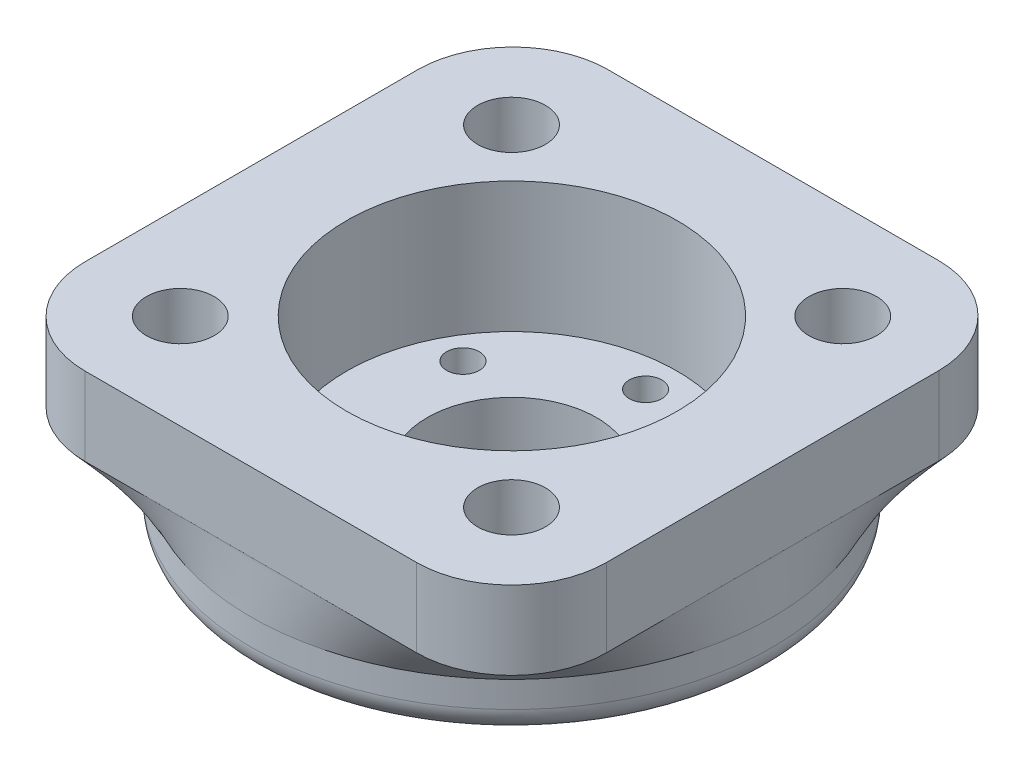
ISO-10303-21;
HEADER;
FILE_DESCRIPTION(('STEP AP214'),'2;1');
FILE_NAME('part.step','',(''),(''),'','','');
FILE_SCHEMA(('AUTOMOTIVE_DESIGN { 1 0 10303 214 1 1 1 1 }'));
ENDSEC;
DATA;
#1=APPLICATION_CONTEXT('core data for automotive mechanical design processes');
#2=APPLICATION_PROTOCOL_DEFINITION('international standard','automotive_design',2000,#1);
#3=PRODUCT_CONTEXT('',#1,'mechanical');
#4=PRODUCT('Part','Part','',(#3));
#5=PRODUCT_RELATED_PRODUCT_CATEGORY('part','',(#4));
#6=PRODUCT_DEFINITION_FORMATION('','',#4);
#7=PRODUCT_DEFINITION_CONTEXT('part definition',#1,'design');
#8=PRODUCT_DEFINITION('design','',#6,#7);
#9=PRODUCT_DEFINITION_SHAPE('','',#8);
#10=(LENGTH_UNIT() NAMED_UNIT(*) SI_UNIT(.MILLI.,.METRE.));
#11=(NAMED_UNIT(*) PLANE_ANGLE_UNIT() SI_UNIT($,.RADIAN.));
#12=(NAMED_UNIT(*) SI_UNIT($,.STERADIAN.) SOLID_ANGLE_UNIT());
#13=UNCERTAINTY_MEASURE_WITH_UNIT(LENGTH_MEASURE(1.E-05),#10,'distance_accuracy_value','');
#14=(GEOMETRIC_REPRESENTATION_CONTEXT(3) GLOBAL_UNCERTAINTY_ASSIGNED_CONTEXT((#13)) GLOBAL_UNIT_ASSIGNED_CONTEXT((#10,
#11,#12)) REPRESENTATION_CONTEXT('',''));
#15=CARTESIAN_POINT('',(0.,0.,0.));
#16=DIRECTION('',(0.,0.,1.));
#17=DIRECTION('',(1.,0.,0.));
#18=AXIS2_PLACEMENT_3D('',#15,#16,#17);
#19=CARTESIAN_POINT('',(0.394837528344683,4.,-0.526450037792892));
#20=DIRECTION('',(0.,-1.,0.));
#21=DIRECTION('',(0.,0.,-1.));
#22=AXIS2_PLACEMENT_3D('',#19,#20,#21);
#23=CYLINDRICAL_SURFACE('',#22,6.50000000000031);
#24=CARTESIAN_POINT('',(0.394837528344683,4.,-0.526450037792892));
#25=DIRECTION('',(0.,1.,0.));
#26=DIRECTION('',(0.,0.,1.));
#27=AXIS2_PLACEMENT_3D('',#24,#25,#26);
#28=CIRCLE('',#27,6.50000000000031);
#29=CARTESIAN_POINT('',(0.394837528344683,4.,5.97354996220742));
#30=VERTEX_POINT('',#29);
#31=EDGE_CURVE('E605',#30,#30,#28,.T.);
#32=ORIENTED_EDGE('',*,*,#31,.T.);
#33=EDGE_LOOP('',(#32));
#34=FACE_BOUND('',#33,.T.);
#35=CARTESIAN_POINT('',(0.394837528344683,0.,-0.526450037792892));
#36=DIRECTION('',(0.,1.,0.));
#37=DIRECTION('',(0.,0.,1.));
#38=AXIS2_PLACEMENT_3D('',#35,#36,#37);
#39=CIRCLE('',#38,6.50000000000031);
#40=CARTESIAN_POINT('',(0.394837528344683,0.,5.97354996220742));
#41=VERTEX_POINT('',#40);
#42=EDGE_CURVE('E633',#41,#41,#39,.T.);
#43=ORIENTED_EDGE('',*,*,#42,.F.);
#44=EDGE_LOOP('',(#43));
#45=FACE_BOUND('',#44,.T.);
#46=ADVANCED_FACE('F193',(#34,#45),#23,.F.);
#47=CARTESIAN_POINT('',(0.394837528344611,4.,9.72354996220711));
#48=DIRECTION('',(0.,-1.,0.));
#49=DIRECTION('',(0.,0.,-1.));
#50=AXIS2_PLACEMENT_3D('',#47,#48,#49);
#51=CYLINDRICAL_SURFACE('',#50,1.25);
#52=CARTESIAN_POINT('',(0.394837528344611,4.,9.72354996220711));
#53=DIRECTION('',(0.,1.,0.));
#54=DIRECTION('',(0.,0.,1.));
#55=AXIS2_PLACEMENT_3D('',#52,#53,#54);
#56=CIRCLE('',#55,1.25);
#57=CARTESIAN_POINT('',(0.394837528344611,4.,10.9735499622071));
#58=VERTEX_POINT('',#57);
#59=EDGE_CURVE('E601',#58,#58,#56,.T.);
#60=ORIENTED_EDGE('',*,*,#59,.T.);
#61=EDGE_LOOP('',(#60));
#62=FACE_BOUND('',#61,.T.);
#63=CARTESIAN_POINT('',(0.394837528344611,0.,9.72354996220711));
#64=DIRECTION('',(0.,1.,0.));
#65=DIRECTION('',(0.,0.,1.));
#66=AXIS2_PLACEMENT_3D('',#63,#64,#65);
#67=CIRCLE('',#66,1.25);
#68=CARTESIAN_POINT('',(0.394837528344611,0.,10.9735499622071));
#69=VERTEX_POINT('',#68);
#70=EDGE_CURVE('E629',#69,#69,#67,.T.);
#71=ORIENTED_EDGE('',*,*,#70,.F.);
#72=EDGE_LOOP('',(#71));
#73=FACE_BOUND('',#72,.T.);
#74=ADVANCED_FACE('F654',(#62,#73),#51,.F.);
#75=CARTESIAN_POINT('',(-8.48192286044587,4.,4.59854996220703));
#76=DIRECTION('',(0.,-1.,0.));
#77=DIRECTION('',(0.,0.,-1.));
#78=AXIS2_PLACEMENT_3D('',#75,#76,#77);
#79=CYLINDRICAL_SURFACE('',#78,1.24999999999999);
#80=CARTESIAN_POINT('',(-8.48192286044587,4.,4.59854996220703));
#81=DIRECTION('',(0.,1.,0.));
#82=DIRECTION('',(0.,0.,1.));
#83=AXIS2_PLACEMENT_3D('',#80,#81,#82);
#84=CIRCLE('',#83,1.24999999999999);
#85=CARTESIAN_POINT('',(-8.48192286044587,4.,5.84854996220702));
#86=VERTEX_POINT('',#85);
#87=EDGE_CURVE('E597',#86,#86,#84,.T.);
#88=ORIENTED_EDGE('',*,*,#87,.T.);
#89=EDGE_LOOP('',(#88));
#90=FACE_BOUND('',#89,.T.);
#91=CARTESIAN_POINT('',(-8.48192286044587,0.,4.59854996220703));
#92=DIRECTION('',(0.,1.,0.));
#93=DIRECTION('',(0.,0.,1.));
#94=AXIS2_PLACEMENT_3D('',#91,#92,#93);
#95=CIRCLE('',#94,1.24999999999999);
#96=CARTESIAN_POINT('',(-8.48192286044587,0.,5.84854996220702));
#97=VERTEX_POINT('',#96);
#98=EDGE_CURVE('E625',#97,#97,#95,.T.);
#99=ORIENTED_EDGE('',*,*,#98,.F.);
#100=EDGE_LOOP('',(#99));
#101=FACE_BOUND('',#100,.T.);
#102=ADVANCED_FACE('F658',(#90,#101),#79,.F.);
#103=CARTESIAN_POINT('',(-8.48192286044576,4.,-5.65145003779299));
#104=DIRECTION('',(0.,-1.,0.));
#105=DIRECTION('',(0.,0.,-1.));
#106=AXIS2_PLACEMENT_3D('',#103,#104,#105);
#107=CYLINDRICAL_SURFACE('',#106,1.25);
#108=CARTESIAN_POINT('',(-8.48192286044576,4.,-5.65145003779299));
#109=DIRECTION('',(0.,1.,0.));
#110=DIRECTION('',(0.,0.,1.));
#111=AXIS2_PLACEMENT_3D('',#108,#109,#110);
#112=CIRCLE('',#111,1.25);
#113=CARTESIAN_POINT('',(-8.48192286044576,4.,-4.40145003779299));
#114=VERTEX_POINT('',#113);
#115=EDGE_CURVE('E593',#114,#114,#112,.T.);
#116=ORIENTED_EDGE('',*,*,#115,.T.);
#117=EDGE_LOOP('',(#116));
#118=FACE_BOUND('',#117,.T.);
#119=CARTESIAN_POINT('',(-8.48192286044576,0.,-5.65145003779299));
#120=DIRECTION('',(0.,1.,0.));
#121=DIRECTION('',(0.,0.,1.));
#122=AXIS2_PLACEMENT_3D('',#119,#120,#121);
#123=CIRCLE('',#122,1.25);
#124=CARTESIAN_POINT('',(-8.48192286044576,0.,-4.40145003779299));
#125=VERTEX_POINT('',#124);
#126=EDGE_CURVE('E621',#125,#125,#123,.T.);
#127=ORIENTED_EDGE('',*,*,#126,.F.);
#128=EDGE_LOOP('',(#127));
#129=FACE_BOUND('',#128,.T.);
#130=ADVANCED_FACE('F662',(#118,#129),#107,.F.);
#131=CARTESIAN_POINT('',(0.394837528344683,4.,-10.7764500377929));
#132=DIRECTION('',(0.,-1.,0.));
#133=DIRECTION('',(0.,0.,-1.));
#134=AXIS2_PLACEMENT_3D('',#131,#132,#133);
#135=CYLINDRICAL_SURFACE('',#134,1.25);
#136=CARTESIAN_POINT('',(0.394837528344683,4.,-10.7764500377929));
#137=DIRECTION('',(0.,1.,0.));
#138=DIRECTION('',(0.,0.,1.));
#139=AXIS2_PLACEMENT_3D('',#136,#137,#138);
#140=CIRCLE('',#139,1.25);
#141=CARTESIAN_POINT('',(0.394837528344683,4.,-9.52645003779289));
#142=VERTEX_POINT('',#141);
#143=EDGE_CURVE('E589',#142,#142,#140,.T.);
#144=ORIENTED_EDGE('',*,*,#143,.T.);
#145=EDGE_LOOP('',(#144));
#146=FACE_BOUND('',#145,.T.);
#147=CARTESIAN_POINT('',(0.394837528344683,0.,-10.7764500377929));
#148=DIRECTION('',(0.,1.,0.));
#149=DIRECTION('',(0.,0.,1.));
#150=AXIS2_PLACEMENT_3D('',#147,#148,#149);
#151=CIRCLE('',#150,1.25);
#152=CARTESIAN_POINT('',(0.394837528344683,0.,-9.52645003779289));
#153=VERTEX_POINT('',#152);
#154=EDGE_CURVE('E617',#153,#153,#151,.T.);
#155=ORIENTED_EDGE('',*,*,#154,.F.);
#156=EDGE_LOOP('',(#155));
#157=FACE_BOUND('',#156,.T.);
#158=ADVANCED_FACE('F666',(#146,#157),#135,.F.);
#159=CARTESIAN_POINT('',(9.27159791713519,4.,-5.65145003779289));
#160=DIRECTION('',(0.,-1.,0.));
#161=DIRECTION('',(0.,0.,-1.));
#162=AXIS2_PLACEMENT_3D('',#159,#160,#161);
#163=CYLINDRICAL_SURFACE('',#162,1.24999999999999);
#164=CARTESIAN_POINT('',(9.27159791713519,4.,-5.65145003779289));
#165=DIRECTION('',(0.,1.,0.));
#166=DIRECTION('',(0.,0.,1.));
#167=AXIS2_PLACEMENT_3D('',#164,#165,#166);
#168=CIRCLE('',#167,1.24999999999999);
#169=CARTESIAN_POINT('',(9.27159791713519,4.,-4.4014500377929));
#170=VERTEX_POINT('',#169);
#171=EDGE_CURVE('E584',#170,#170,#168,.T.);
#172=ORIENTED_EDGE('',*,*,#171,.T.);
#173=EDGE_LOOP('',(#172));
#174=FACE_BOUND('',#173,.T.);
#175=CARTESIAN_POINT('',(9.27159791713519,0.,-5.65145003779289));
#176=DIRECTION('',(0.,1.,0.));
#177=DIRECTION('',(0.,0.,1.));
#178=AXIS2_PLACEMENT_3D('',#175,#176,#177);
#179=CIRCLE('',#178,1.24999999999999);
#180=CARTESIAN_POINT('',(9.27159791713519,0.,-4.4014500377929));
#181=VERTEX_POINT('',#180);
#182=EDGE_CURVE('E613',#181,#181,#179,.T.);
#183=ORIENTED_EDGE('',*,*,#182,.F.);
#184=EDGE_LOOP('',(#183));
#185=FACE_BOUND('',#184,.T.);
#186=ADVANCED_FACE('F670',(#174,#185),#163,.F.);
#187=CARTESIAN_POINT('',(9.27159791713516,4.,4.59854996220711));
#188=DIRECTION('',(0.,-1.,0.));
#189=DIRECTION('',(0.,0.,-1.));
#190=AXIS2_PLACEMENT_3D('',#187,#188,#189);
#191=CYLINDRICAL_SURFACE('',#190,1.26386065401982);
#192=CARTESIAN_POINT('',(9.27159791713516,4.,4.59854996220711));
#193=DIRECTION('',(0.,1.,0.));
#194=DIRECTION('',(0.,0.,1.));
#195=AXIS2_PLACEMENT_3D('',#192,#193,#194);
#196=CIRCLE('',#195,1.26386065401982);
#197=CARTESIAN_POINT('',(9.27159791713516,4.,5.86241061622693));
#198=VERTEX_POINT('',#197);
#199=EDGE_CURVE('E580',#198,#198,#196,.T.);
#200=ORIENTED_EDGE('',*,*,#199,.T.);
#201=EDGE_LOOP('',(#200));
#202=FACE_BOUND('',#201,.T.);
#203=CARTESIAN_POINT('',(9.27159791713516,0.,4.59854996220711));
#204=DIRECTION('',(0.,1.,0.));
#205=DIRECTION('',(0.,0.,1.));
#206=AXIS2_PLACEMENT_3D('',#203,#204,#205);
#207=CIRCLE('',#206,1.26386065401982);
#208=CARTESIAN_POINT('',(9.27159791713516,0.,5.86241061622693));
#209=VERTEX_POINT('',#208);
#210=EDGE_CURVE('E385',#209,#209,#207,.T.);
#211=ORIENTED_EDGE('',*,*,#210,.F.);
#212=EDGE_LOOP('',(#211));
#213=FACE_BOUND('',#212,.T.);
#214=ADVANCED_FACE('F650',(#202,#213),#191,.F.);
#215=CARTESIAN_POINT('',(0.394837528344683,4.,-0.526450037792892));
#216=DIRECTION('',(0.,-1.,0.));
#217=DIRECTION('',(0.,0.,-1.));
#218=AXIS2_PLACEMENT_3D('',#215,#216,#217);
#219=CYLINDRICAL_SURFACE('',#218,20.);
#220=CARTESIAN_POINT('',(0.394837528344683,2.,-0.526450037792892));
#221=DIRECTION('',(0.,1.,0.));
#222=DIRECTION('',(0.,0.,1.));
#223=AXIS2_PLACEMENT_3D('',#220,#221,#222);
#224=CIRCLE('',#223,20.);
#225=CARTESIAN_POINT('',(0.394837528344683,2.,19.4735499622071));
#226=VERTEX_POINT('',#225);
#227=EDGE_CURVE('E202',#226,#226,#224,.T.);
#228=ORIENTED_EDGE('',*,*,#227,.T.);
#229=EDGE_LOOP('',(#228));
#230=FACE_BOUND('',#229,.T.);
#231=CARTESIAN_POINT('',(17.2623550113204,4.,-11.2729310414288));
#232=CARTESIAN_POINT('',(16.8472630465657,4.,-11.9244532439222));
#233=CARTESIAN_POINT('',(15.9784248748347,3.99999999999999,-13.1242882814573));
#234=CARTESIAN_POINT('',(14.5442368778005,4.00000000000001,-14.7147888358139));
#235=CARTESIAN_POINT('',(12.9499665411757,4.,-16.1444470503483));
#236=CARTESIAN_POINT('',(11.7481686373102,4.,-17.0097155118139));
#237=CARTESIAN_POINT('',(9.53911566240006,4.,-18.4087802388518));
#238=CARTESIAN_POINT('',(6.09924045383232,4.,-19.9782041450023));
#239=CARTESIAN_POINT('',(0.387221258468894,4.,-20.8022193623676));
#240=CARTESIAN_POINT('',(-5.32437062189815,3.99999999999999,-19.9738937771033));
#241=CARTESIAN_POINT('',(-8.76336978348836,4.,-18.4016733878634));
#242=CARTESIAN_POINT('',(-10.9678231444701,4.,-17.0030818995773));
#243=CARTESIAN_POINT('',(-12.1623958960564,4.,-16.1421902956546));
#244=CARTESIAN_POINT('',(-13.7478057921111,4.,-14.7209184903639));
#245=CARTESIAN_POINT('',(-15.1750364842467,4.,-13.140536028565));
#246=CARTESIAN_POINT('',(-16.0405899202001,4.,-11.9486587772768));
#247=CARTESIAN_POINT('',(-17.4541821027537,4.,-9.73817455584147));
#248=CARTESIAN_POINT('',(-19.0468110426739,4.,-6.27898675560021));
#249=CARTESIAN_POINT('',(-19.8848538975014,4.,-0.526838354082022));
#250=CARTESIAN_POINT('',(-19.0470598448636,4.,5.22505782301706));
#251=CARTESIAN_POINT('',(-17.4548778288352,4.,8.68386085223672));
#252=CARTESIAN_POINT('',(-16.455476098865,4.,10.2469863065065));
#253=B_SPLINE_CURVE_WITH_KNOTS('',3,(#231,#232,#233,#234,#235,#236,#237,#238,#239,#240,#241,
#242,#243,#244,#245,#246,#247,#248,#249,#250,#251,#252),.UNSPECIFIED.,.F.,.F.,(4,1,1,1,2,1,1,1,
2,1,1,1,2,1,1,1,4),(0.499792920357181,0.518230534345443,0.536668148333704,0.555105762321966,
0.573543376310227,0.61754572409604,0.661548071881852,0.705550419667664,0.749552767453476,
0.767884083593789,0.786215399734101,0.804546715874413,0.822878032014725,0.867158524011044,
0.911439016007362,0.955719508003681,1.),.UNSPECIFIED.);
#254=CARTESIAN_POINT('',(17.2639069388397,4.,-11.2739171008657));
#255=VERTEX_POINT('',#254);
#256=CARTESIAN_POINT('',(-16.4570316973134,4.,10.2479783940124));
#257=VERTEX_POINT('',#256);
#258=EDGE_CURVE('E212',#255,#257,#253,.T.);
#259=ORIENTED_EDGE('',*,*,#258,.F.);
#260=CARTESIAN_POINT('',(0.394837528344683,4.,-0.526450037792892));
#261=DIRECTION('',(0.,1.,0.));
#262=DIRECTION('',(0.,0.,1.));
#263=AXIS2_PLACEMENT_3D('',#260,#261,#262);
#264=CIRCLE('',#263,20.);
#265=EDGE_CURVE('E208',#257,#255,#264,.T.);
#266=ORIENTED_EDGE('',*,*,#265,.F.);
#267=EDGE_LOOP('',(#259,#266));
#268=FACE_BOUND('',#267,.T.);
#269=ADVANCED_FACE('F640',(#230,#268),#219,.T.);
#270=CARTESIAN_POINT('',(0.,0.,0.));
#271=DIRECTION('',(0.,1.,0.));
#272=DIRECTION('',(0.,0.,1.));
#273=AXIS2_PLACEMENT_3D('',#270,#271,#272);
#274=PLANE('',#273);
#275=CARTESIAN_POINT('',(0.394837528344683,0.,-0.526450037792892));
#276=DIRECTION('',(0.,1.,0.));
#277=DIRECTION('',(0.,0.,1.));
#278=AXIS2_PLACEMENT_3D('',#275,#276,#277);
#279=CIRCLE('',#278,18.);
#280=CARTESIAN_POINT('',(0.394837528344683,0.,17.4735499622071));
#281=VERTEX_POINT('',#280);
#282=EDGE_CURVE('E12',#281,#281,#279,.F.);
#283=ORIENTED_EDGE('',*,*,#282,.T.);
#284=EDGE_LOOP('',(#283));
#285=FACE_BOUND('',#284,.T.);
#286=ORIENTED_EDGE('',*,*,#210,.T.);
#287=EDGE_LOOP('',(#286));
#288=FACE_BOUND('',#287,.T.);
#289=ORIENTED_EDGE('',*,*,#182,.T.);
#290=EDGE_LOOP('',(#289));
#291=FACE_BOUND('',#290,.T.);
#292=ORIENTED_EDGE('',*,*,#154,.T.);
#293=EDGE_LOOP('',(#292));
#294=FACE_BOUND('',#293,.T.);
#295=ORIENTED_EDGE('',*,*,#126,.T.);
#296=EDGE_LOOP('',(#295));
#297=FACE_BOUND('',#296,.T.);
#298=ORIENTED_EDGE('',*,*,#98,.T.);
#299=EDGE_LOOP('',(#298));
#300=FACE_BOUND('',#299,.T.);
#301=ORIENTED_EDGE('',*,*,#70,.T.);
#302=EDGE_LOOP('',(#301));
#303=FACE_BOUND('',#302,.T.);
#304=ORIENTED_EDGE('',*,*,#42,.T.);
#305=EDGE_LOOP('',(#304));
#306=FACE_BOUND('',#305,.T.);
#307=ADVANCED_FACE('F649',(#285,#288,#291,#294,#297,#300,#303,#306),#274,.F.);
#308=CARTESIAN_POINT('',(-19.5657480045988,8.,12.2398912333111));
#309=CARTESIAN_POINT('',(-16.455476098865,4.,10.2469863065065));
#310=CARTESIAN_POINT('',(-19.5674550667228,8.,10.0631165668543));
#311=CARTESIAN_POINT('',(-17.4548778288352,4.,8.68386085223672));
#312=CARTESIAN_POINT('',(-19.5674550667228,8.00000000000001,5.78402143430806));
#313=CARTESIAN_POINT('',(-19.0470598448636,4.,5.22505782301706));
#314=CARTESIAN_POINT('',(-19.5674550667228,7.99999999999999,-0.532223380575484));
#315=CARTESIAN_POINT('',(-19.8848538975014,4.,-0.526838354082022));
#316=CARTESIAN_POINT('',(-19.5674550667228,8.00000000000002,-6.84821486150297));
#317=CARTESIAN_POINT('',(-19.0468110426739,4.,-6.27898675560021));
#318=CARTESIAN_POINT('',(-19.5674550667228,8.,-11.1267781427296));
#319=CARTESIAN_POINT('',(-17.4541821027537,4.,-9.73817455584147));
#320=CARTESIAN_POINT('',(-19.5610452452733,8.,-14.2041391079451));
#321=CARTESIAN_POINT('',(-16.0405899202001,4.,-11.9486587772768));
#322=CARTESIAN_POINT('',(-19.2085941765575,8.00000000000001,-16.0731562797602));
#323=CARTESIAN_POINT('',(-15.1750364842467,4.,-13.140536028565));
#324=CARTESIAN_POINT('',(-17.5683336132762,7.99999999999999,-18.564932976207));
#325=CARTESIAN_POINT('',(-13.7478057921111,4.,-14.7209184903639));
#326=CARTESIAN_POINT('',(-15.0765433466251,8.00000000000001,-20.2061867794326));
#327=CARTESIAN_POINT('',(-12.1623958960564,4.,-16.1421902956546));
#328=CARTESIAN_POINT('',(-13.2066419902366,8.,-20.5590529177205));
#329=CARTESIAN_POINT('',(-10.9678231444701,4.,-17.0030818995773));
#330=CARTESIAN_POINT('',(-10.1412033151175,8.,-20.5654663974794));
#331=CARTESIAN_POINT('',(-8.76336978348836,4.,-18.4016733878634));
#332=CARTESIAN_POINT('',(-5.88664465658773,8.,-20.5654663974794));
#333=CARTESIAN_POINT('',(-5.32437062189815,3.99999999999999,-19.9738937771033));
#334=CARTESIAN_POINT('',(0.394440329843793,8.,-20.5654663974794));
#335=CARTESIAN_POINT('',(0.387221258468894,4.,-20.8022193623676));
#336=CARTESIAN_POINT('',(6.67569790487396,7.99999999999999,-20.5654663974795));
#337=CARTESIAN_POINT('',(6.09924045383232,4.,-19.9782041450023));
#338=CARTESIAN_POINT('',(10.9306188002466,8.,-20.5654663974795));
#339=CARTESIAN_POINT('',(9.53911566240006,4.,-18.4087802388518));
#340=CARTESIAN_POINT('',(14.0016668844119,8.,-20.5613629130341));
#341=CARTESIAN_POINT('',(11.7481686373102,4.,-17.0097155118139));
#342=CARTESIAN_POINT('',(15.8835127646625,8.00000000000001,-20.2101093081403));
#343=CARTESIAN_POINT('',(12.9499665411757,4.,-16.1444470503483));
#344=CARTESIAN_POINT('',(18.3913726922979,7.99999999999999,-18.5607190115697));
#345=CARTESIAN_POINT('',(14.5442368778005,4.00000000000001,-14.7147888358139));
#346=CARTESIAN_POINT('',(20.039858754379,8.00000000000001,-16.0528707161958));
#347=CARTESIAN_POINT('',(15.9784248748347,3.99999999999999,-13.1242882814573));
#348=CARTESIAN_POINT('',(20.3907361573421,8.,-14.1718287036585));
#349=CARTESIAN_POINT('',(16.8472630465657,4.,-11.9244532439222));
#350=CARTESIAN_POINT('',(20.3948375283447,8.,-13.2654663974849));
#351=CARTESIAN_POINT('',(17.2623550113204,4.,-11.2729310414288));
#352=B_SPLINE_SURFACE_WITH_KNOTS('',3,1,((#308,#309),(#310,#311),(#312,#313),(#314,#315),(#316,
#317),(#318,#319),(#320,#321),(#322,#323),(#324,#325),(#326,#327),(#328,#329),(#330,#331),(#332,
#333),(#334,#335),(#336,#337),(#338,#339),(#340,#341),(#342,#343),(#344,#345),(#346,#347),(#348,
#349),(#350,#351)),.UNSPECIFIED.,.F.,.F.,.F.,(4,1,1,1,2,1,1,1,2,1,1,1,2,1,1,1,4),(2,2),
(0.499792920357181,0.5440734123535,0.588353904349819,0.632634396346137,0.676914888342456,
0.695246204482768,0.71357752062308,0.731908836763393,0.750240152903705,0.794242500689517,
0.83824484847533,0.882247196261142,0.926249544046954,0.944687158035215,0.963124772023477,
0.981562386011739,1.),(0.,1.),.UNSPECIFIED.);
#353=DIRECTION('',(0.,0.,-1.));
#354=VECTOR('',#353,1.);
#355=CARTESIAN_POINT('',(-19.5674550667228,8.,0.));
#356=LINE('',#355,#354);
#357=CARTESIAN_POINT('',(-19.5666015356608,8.,12.2398923779146));
#358=VERTEX_POINT('',#357);
#359=CARTESIAN_POINT('',(-19.5651884741447,8.,-13.3031690796522));
#360=VERTEX_POINT('',#359);
#361=EDGE_CURVE('E290',#358,#360,#356,.T.);
#362=CARTESIAN_POINT('',(-19.5657480045988,8.,12.2398912333111));
#363=CARTESIAN_POINT('',(-19.5674550667228,8.,10.0631165668543));
#364=CARTESIAN_POINT('',(-19.5674550667228,8.00000000000001,5.78402143430806));
#365=CARTESIAN_POINT('',(-19.5674550667228,7.99999999999999,-0.532223380575484));
#366=CARTESIAN_POINT('',(-19.5674550667228,8.00000000000002,-6.84821486150297));
#367=CARTESIAN_POINT('',(-19.5674550667228,8.,-11.1267781427296));
#368=CARTESIAN_POINT('',(-19.5610452452733,8.,-14.2041391079451));
#369=CARTESIAN_POINT('',(-19.2085941765575,8.00000000000001,-16.0731562797602));
#370=CARTESIAN_POINT('',(-17.5683336132762,7.99999999999999,-18.564932976207));
#371=CARTESIAN_POINT('',(-15.0765433466251,8.00000000000001,-20.2061867794326));
#372=CARTESIAN_POINT('',(-13.2066419902366,8.,-20.5590529177205));
#373=CARTESIAN_POINT('',(-10.1412033151175,8.,-20.5654663974794));
#374=CARTESIAN_POINT('',(-5.88664465658773,8.,-20.5654663974794));
#375=CARTESIAN_POINT('',(0.394440329843793,8.,-20.5654663974794));
#376=CARTESIAN_POINT('',(6.67569790487396,7.99999999999999,-20.5654663974795));
#377=CARTESIAN_POINT('',(10.9306188002466,8.,-20.5654663974795));
#378=CARTESIAN_POINT('',(14.0016668844119,8.,-20.5613629130341));
#379=CARTESIAN_POINT('',(15.8835127646625,8.00000000000001,-20.2101093081403));
#380=CARTESIAN_POINT('',(18.3913726922979,7.99999999999999,-18.5607190115697));
#381=CARTESIAN_POINT('',(20.039858754379,8.00000000000001,-16.0528707161958));
#382=CARTESIAN_POINT('',(20.3907361573421,8.,-14.1718287036585));
#383=CARTESIAN_POINT('',(20.3948375283447,8.,-13.2654663974849));
#384=B_SPLINE_CURVE_WITH_KNOTS('',3,(#362,#363,#364,#365,#366,#367,#368,#369,#370,#371,#372,
#373,#374,#375,#376,#377,#378,#379,#380,#381,#382,#383),.UNSPECIFIED.,.F.,.F.,(4,1,1,1,2,1,1,1,
2,1,1,1,2,1,1,1,4),(0.499792920357181,0.5440734123535,0.588353904349819,0.632634396346137,
0.676914888342456,0.695246204482768,0.71357752062308,0.731908836763393,0.750240152903705,
0.794242500689517,0.83824484847533,0.882247196261142,0.926249544046954,0.944687158035215,
0.963124772023477,0.981562386011739,1.),.UNSPECIFIED.);
#385=CARTESIAN_POINT('',(-12.3051577348471,8.,-20.5632027006693));
#386=VERTEX_POINT('',#385);
#387=EDGE_CURVE('E527',#360,#386,#384,.T.);
#388=DIRECTION('',(1.,0.,0.));
#389=VECTOR('',#388,1.);
#390=CARTESIAN_POINT('',(-1.5169066591533E-13,8.,-20.5654663974795));
#391=LINE('',#390,#389);
#392=CARTESIAN_POINT('',(13.0948355971086,8.,-20.5640205031471));
#393=VERTEX_POINT('',#392);
#394=EDGE_CURVE('E486',#386,#393,#391,.T.);
#395=CARTESIAN_POINT('',(-19.5657480045988,8.,12.2398912333111));
#396=CARTESIAN_POINT('',(-19.5674550667228,8.,10.0631165668543));
#397=CARTESIAN_POINT('',(-19.5674550667228,8.00000000000001,5.78402143430806));
#398=CARTESIAN_POINT('',(-19.5674550667228,7.99999999999999,-0.532223380575484));
#399=CARTESIAN_POINT('',(-19.5674550667228,8.00000000000002,-6.84821486150297));
#400=CARTESIAN_POINT('',(-19.5674550667228,8.,-11.1267781427296));
#401=CARTESIAN_POINT('',(-19.5610452452733,8.,-14.2041391079451));
#402=CARTESIAN_POINT('',(-19.2085941765575,8.00000000000001,-16.0731562797602));
#403=CARTESIAN_POINT('',(-17.5683336132762,7.99999999999999,-18.564932976207));
#404=CARTESIAN_POINT('',(-15.0765433466251,8.00000000000001,-20.2061867794326));
#405=CARTESIAN_POINT('',(-13.2066419902366,8.,-20.5590529177205));
#406=CARTESIAN_POINT('',(-10.1412033151175,8.,-20.5654663974794));
#407=CARTESIAN_POINT('',(-5.88664465658773,8.,-20.5654663974794));
#408=CARTESIAN_POINT('',(0.394440329843793,8.,-20.5654663974794));
#409=CARTESIAN_POINT('',(6.67569790487396,7.99999999999999,-20.5654663974795));
#410=CARTESIAN_POINT('',(10.9306188002466,8.,-20.5654663974795));
#411=CARTESIAN_POINT('',(14.0016668844119,8.,-20.5613629130341));
#412=CARTESIAN_POINT('',(15.8835127646625,8.00000000000001,-20.2101093081403));
#413=CARTESIAN_POINT('',(18.3913726922979,7.99999999999999,-18.5607190115697));
#414=CARTESIAN_POINT('',(20.039858754379,8.00000000000001,-16.0528707161958));
#415=CARTESIAN_POINT('',(20.3907361573421,8.,-14.1718287036585));
#416=CARTESIAN_POINT('',(20.3948375283447,8.,-13.2654663974849));
#417=B_SPLINE_CURVE_WITH_KNOTS('',3,(#395,#396,#397,#398,#399,#400,#401,#402,#403,#404,#405,
#406,#407,#408,#409,#410,#411,#412,#413,#414,#415,#416),.UNSPECIFIED.,.F.,.F.,(4,1,1,1,2,1,1,1,
2,1,1,1,2,1,1,1,4),(0.499792920357181,0.5440734123535,0.588353904349819,0.632634396346137,
0.676914888342456,0.695246204482768,0.71357752062308,0.731908836763393,0.750240152903705,
0.794242500689517,0.83824484847533,0.882247196261142,0.926249544046954,0.944687158035215,
0.963124772023477,0.981562386011739,1.),.UNSPECIFIED.);
#418=CARTESIAN_POINT('',(20.3948375283447,8.,-13.2654663974849));
#419=VERTEX_POINT('',#418);
#420=EDGE_CURVE('E463',#393,#419,#417,.T.);
#421=DIRECTION('',(-0.573993575646514,-0.732956781117855,0.365110575209597));
#422=VECTOR('',#421,1.);
#423=CARTESIAN_POINT('',(18.8285962698326,6.,-12.2691987194568));
#424=LINE('',#423,#422);
#425=EDGE_CURVE('E386',#419,#255,#424,.T.);
#426=DIRECTION('',(0.571240842053931,-0.734650679255218,-0.36602223954203));
#427=VECTOR('',#426,1.);
#428=CARTESIAN_POINT('',(-18.0106120517319,6.,11.2434387699088));
#429=LINE('',#428,#427);
#430=EDGE_CURVE('E302',#358,#257,#429,.T.);
#431=ORIENTED_EDGE('',*,*,#361,.T.);
#432=ORIENTED_EDGE('',*,*,#387,.T.);
#433=ORIENTED_EDGE('',*,*,#394,.T.);
#434=ORIENTED_EDGE('',*,*,#420,.T.);
#435=ORIENTED_EDGE('',*,*,#425,.T.);
#436=ORIENTED_EDGE('',*,*,#258,.T.);
#437=ORIENTED_EDGE('',*,*,#430,.F.);
#438=EDGE_LOOP('',(#431,#432,#433,#434,#435,#436,#437));
#439=FACE_BOUND('',#438,.T.);
#440=ADVANCED_FACE('F325',(#439),#352,.T.);
#441=CARTESIAN_POINT('',(20.3948375283447,8.,-13.2654663974849));
#442=CARTESIAN_POINT('',(17.2623550113204,4.,-11.2729310414288));
#443=CARTESIAN_POINT('',(20.3948375283447,8.,-11.0951429059621));
#444=CARTESIAN_POINT('',(18.2563003861262,4.,-9.7128490963728));
#445=CARTESIAN_POINT('',(20.3948375283447,8.,-6.82907116383582));
#446=CARTESIAN_POINT('',(19.8396991950961,3.99999999999999,-6.26233899419021));
#447=CARTESIAN_POINT('',(20.3948375283447,8.00000000000001,-0.532227196130221));
#448=CARTESIAN_POINT('',(20.6729238536275,4.,-0.526835418629835));
#449=CARTESIAN_POINT('',(20.3948375283447,7.99999999999999,5.76487165280737));
#450=CARTESIAN_POINT('',(19.8399458721145,4.,5.20841328308177));
#451=CARTESIAN_POINT('',(20.3948375283447,8.,10.0314786601483));
#452=CARTESIAN_POINT('',(18.2569941706072,4.,8.65853407813329));
#453=CARTESIAN_POINT('',(20.3947576443956,8.,13.1093583927037));
#454=CARTESIAN_POINT('',(16.8481221778317,4.,10.8703406879392));
#455=CARTESIAN_POINT('',(20.0500729843433,8.,14.994113489022));
#456=CARTESIAN_POINT('',(15.9792031423258,3.99999999999999,12.0704180852626));
#457=CARTESIAN_POINT('',(18.4019575807264,7.99999999999999,17.5082680899424));
#458=CARTESIAN_POINT('',(14.5452484151712,4.00000000000001,13.660869756937));
#459=CARTESIAN_POINT('',(15.8879376963527,8.00000000000001,19.1574643513503));
#460=CARTESIAN_POINT('',(12.9512230417574,4.,15.0905320440991));
#461=CARTESIAN_POINT('',(14.0024510559469,8.,19.5026691998348));
#462=CARTESIAN_POINT('',(11.7492827883781,4.,15.9560681678857));
#463=CARTESIAN_POINT('',(10.9302090426731,8.,19.5028290454598));
#464=CARTESIAN_POINT('',(9.54009607246869,4.,17.3553584658873));
#465=CARTESIAN_POINT('',(6.67512140930941,8.00000000000001,19.5028290454599));
#466=CARTESIAN_POINT('',(6.10025110537089,4.,18.925077737478));
#467=CARTESIAN_POINT('',(0.394435672855324,7.99999999999999,19.5028290454598));
#468=CARTESIAN_POINT('',(0.387225680761736,3.99999999999999,19.7494355602821));
#469=CARTESIAN_POINT('',(-5.88607557349468,8.,19.5028290454598));
#470=CARTESIAN_POINT('',(-5.3253750788876,4.00000000000001,18.9207688660317));
#471=CARTESIAN_POINT('',(-10.1407968483593,8.,19.5028290454598));
#472=CARTESIAN_POINT('',(-8.76434825667374,4.,17.3482519075704));
#473=CARTESIAN_POINT('',(-13.2074286703242,8.,19.5003335996616));
#474=CARTESIAN_POINT('',(-10.968934984441,4.,15.9494349666277));
#475=CARTESIAN_POINT('',(-15.0809522252086,8.,19.153472795644));
#476=CARTESIAN_POINT('',(-12.1636494080279,4.00000000000001,15.0882774741031));
#477=CARTESIAN_POINT('',(-17.5788517690881,8.00000000000001,17.5124142840823));
#478=CARTESIAN_POINT('',(-13.7488168669406,4.,13.6670009808375));
#479=CARTESIAN_POINT('',(-19.2187391000035,7.99999999999999,15.0143818068208));
#480=CARTESIAN_POINT('',(-15.1758164791849,4.,12.0866659420278));
#481=CARTESIAN_POINT('',(-19.565040814318,8.,13.1416708850322));
#482=CARTESIAN_POINT('',(-16.0414506336345,4.,10.8945474663587));
#483=CARTESIAN_POINT('',(-19.5657480045988,8.,12.2398912333111));
#484=CARTESIAN_POINT('',(-16.455476098865,4.,10.2469863065065));
#485=B_SPLINE_SURFACE_WITH_KNOTS('',3,1,((#441,#442),(#443,#444),(#445,#446),(#447,#448),(#449,
#450),(#451,#452),(#453,#454),(#455,#456),(#457,#458),(#459,#460),(#461,#462),(#463,#464),(#465,
#466),(#467,#468),(#469,#470),(#471,#472),(#473,#474),(#475,#476),(#477,#478),(#479,#480),(#481,
#482),(#483,#484)),.UNSPECIFIED.,.F.,.F.,.F.,(4,1,1,1,2,1,1,1,2,1,1,1,2,1,1,1,4),(2,2),(0.,
0.0441492067284316,0.0882984134568633,0.132447620185295,0.176596826913727,0.195047464850219,
0.213498102786712,0.231948740723204,0.250399378659697,0.294403537983957,0.338407697308217,
0.382411856632478,0.426416015956738,0.444760242056849,0.463104468156959,0.48144869425707,
0.499792920357181),(0.,1.),.UNSPECIFIED.);
#486=DIRECTION('',(0.,0.,1.));
#487=VECTOR('',#486,1.);
#488=CARTESIAN_POINT('',(20.3948375283447,8.,0.));
#489=LINE('',#488,#487);
#490=CARTESIAN_POINT('',(20.394809358842,8.,12.2021861067072));
#491=VERTEX_POINT('',#490);
#492=EDGE_CURVE('E412',#419,#491,#489,.T.);
#493=CARTESIAN_POINT('',(13.0935515673804,8.,12.2015431694194));
#494=DIRECTION('',(0.,-1.,0.));
#495=DIRECTION('',(0.,0.,1.));
#496=AXIS2_PLACEMENT_3D('',#493,#494,#495);
#497=CIRCLE('',#496,7.3012859892723);
#498=CARTESIAN_POINT('',(13.0948374404119,8.,19.5027727337537));
#499=VERTEX_POINT('',#498);
#500=EDGE_CURVE('E298',#491,#499,#497,.T.);
#501=DIRECTION('',(-1.,0.,0.));
#502=VECTOR('',#501,1.);
#503=CARTESIAN_POINT('',(0.,8.,19.5028290454598));
#504=LINE('',#503,#502);
#505=CARTESIAN_POINT('',(-12.3051618402944,8.,19.5019484288663));
#506=VERTEX_POINT('',#505);
#507=EDGE_CURVE('E269',#499,#506,#504,.T.);
#508=CARTESIAN_POINT('',(-12.2850211434944,8.,12.2203968769571));
#509=DIRECTION('',(0.,-1.,0.));
#510=DIRECTION('',(0.,0.,1.));
#511=AXIS2_PLACEMENT_3D('',#508,#509,#510);
#512=CIRCLE('',#511,7.28246002154324);
#513=EDGE_CURVE('E281',#506,#358,#512,.T.);
#514=ORIENTED_EDGE('',*,*,#492,.T.);
#515=ORIENTED_EDGE('',*,*,#500,.T.);
#516=ORIENTED_EDGE('',*,*,#507,.T.);
#517=ORIENTED_EDGE('',*,*,#513,.T.);
#518=ORIENTED_EDGE('',*,*,#430,.T.);
#519=ORIENTED_EDGE('',*,*,#265,.T.);
#520=ORIENTED_EDGE('',*,*,#425,.F.);
#521=EDGE_LOOP('',(#514,#515,#516,#517,#518,#519,#520));
#522=FACE_BOUND('',#521,.T.);
#523=ADVANCED_FACE('F296',(#522),#485,.T.);
#524=CARTESIAN_POINT('',(-12.2850211434944,8.,12.2203968769571));
#525=DIRECTION('',(0.,1.,0.));
#526=DIRECTION('',(0.,0.,1.));
#527=AXIS2_PLACEMENT_3D('',#524,#525,#526);
#528=CYLINDRICAL_SURFACE('',#527,7.28246002154324);
#529=CARTESIAN_POINT('',(-12.2850211434944,14.,12.2203968769571));
#530=DIRECTION('',(0.,1.,0.));
#531=DIRECTION('',(0.,0.,1.));
#532=AXIS2_PLACEMENT_3D('',#529,#530,#531);
#533=CIRCLE('',#532,7.28246002154324);
#534=CARTESIAN_POINT('',(-12.3051625568587,14.,19.5028290454598));
#535=VERTEX_POINT('',#534);
#536=CARTESIAN_POINT('',(-19.5674550667228,14.,12.2398935225181));
#537=VERTEX_POINT('',#536);
#538=EDGE_CURVE('E818',#535,#537,#533,.F.);
#539=ORIENTED_EDGE('',*,*,#538,.T.);
#540=DIRECTION('',(0.,1.,0.));
#541=VECTOR('',#540,1.);
#542=CARTESIAN_POINT('',(-19.5674550667228,8.,12.2398935225181));
#543=LINE('',#542,#541);
#544=EDGE_CURVE('E284',#358,#537,#543,.T.);
#545=ORIENTED_EDGE('',*,*,#544,.F.);
#546=ORIENTED_EDGE('',*,*,#513,.F.);
#547=DIRECTION('',(0.,1.,0.));
#548=VECTOR('',#547,1.);
#549=CARTESIAN_POINT('',(-12.3051625568587,8.,19.5028290454598));
#550=LINE('',#549,#548);
#551=EDGE_CURVE('E265',#506,#535,#550,.T.);
#552=ORIENTED_EDGE('',*,*,#551,.T.);
#553=EDGE_LOOP('',(#539,#545,#546,#552));
#554=FACE_BOUND('',#553,.T.);
#555=ADVANCED_FACE('F283',(#554),#528,.T.);
#556=CARTESIAN_POINT('',(-19.5674550667228,8.,0.));
#557=DIRECTION('',(-1.,0.,0.));
#558=DIRECTION('',(0.,0.,1.));
#559=AXIS2_PLACEMENT_3D('',#556,#557,#558);
#560=PLANE('',#559);
#561=DIRECTION('',(0.,0.,1.));
#562=VECTOR('',#561,1.);
#563=CARTESIAN_POINT('',(-19.5674550667228,14.,0.));
#564=LINE('',#563,#562);
#565=CARTESIAN_POINT('',(-19.5674550667228,14.,-13.3031738024113));
#566=VERTEX_POINT('',#565);
#567=EDGE_CURVE('E758',#566,#537,#564,.T.);
#568=ORIENTED_EDGE('',*,*,#567,.F.);
#569=DIRECTION('',(0.,1.,0.));
#570=VECTOR('',#569,1.);
#571=CARTESIAN_POINT('',(-19.5674550667228,8.,-13.3031738024113));
#572=LINE('',#571,#570);
#573=EDGE_CURVE('E513',#360,#566,#572,.T.);
#574=ORIENTED_EDGE('',*,*,#573,.F.);
#575=ORIENTED_EDGE('',*,*,#361,.F.);
#576=ORIENTED_EDGE('',*,*,#544,.T.);
#577=EDGE_LOOP('',(#568,#574,#575,#576));
#578=FACE_BOUND('',#577,.T.);
#579=ADVANCED_FACE('F503',(#578),#560,.T.);
#580=CARTESIAN_POINT('',(-12.253125454751,8.,-13.2511367855078));
#581=DIRECTION('',(0.,1.,0.));
#582=DIRECTION('',(0.,0.,1.));
#583=AXIS2_PLACEMENT_3D('',#580,#581,#582);
#584=CYLINDRICAL_SURFACE('',#583,7.31451471552908);
#585=CARTESIAN_POINT('',(-12.253125454751,14.,-13.2511367855078));
#586=DIRECTION('',(0.,1.,0.));
#587=DIRECTION('',(0.,0.,1.));
#588=AXIS2_PLACEMENT_3D('',#585,#586,#587);
#589=CIRCLE('',#588,7.31451471552908);
#590=CARTESIAN_POINT('',(-12.3051624716203,14.,-20.5654663974794));
#591=VERTEX_POINT('',#590);
#592=EDGE_CURVE('E766',#566,#591,#589,.F.);
#593=ORIENTED_EDGE('',*,*,#592,.T.);
#594=DIRECTION('',(0.,1.,0.));
#595=VECTOR('',#594,1.);
#596=CARTESIAN_POINT('',(-12.3051624716203,8.,-20.5654663974794));
#597=LINE('',#596,#595);
#598=EDGE_CURVE('E476',#386,#591,#597,.T.);
#599=ORIENTED_EDGE('',*,*,#598,.F.);
#600=ORIENTED_EDGE('',*,*,#387,.F.);
#601=ORIENTED_EDGE('',*,*,#573,.T.);
#602=EDGE_LOOP('',(#593,#599,#600,#601));
#603=FACE_BOUND('',#602,.T.);
#604=ADVANCED_FACE('F500',(#603),#584,.T.);
#605=CARTESIAN_POINT('',(-1.5169066591533E-13,8.,-20.5654663974795));
#606=DIRECTION('',(0.,0.,-1.));
#607=DIRECTION('',(-1.,0.,0.));
#608=AXIS2_PLACEMENT_3D('',#605,#606,#607);
#609=PLANE('',#608);
#610=DIRECTION('',(-1.,0.,0.));
#611=VECTOR('',#610,1.);
#612=CARTESIAN_POINT('',(-1.5169066591533E-13,14.,-20.5654663974795));
#613=LINE('',#612,#611);
#614=CARTESIAN_POINT('',(13.0948375283504,14.,-20.5654663974796));
#615=VERTEX_POINT('',#614);
#616=EDGE_CURVE('E835',#615,#591,#613,.T.);
#617=ORIENTED_EDGE('',*,*,#616,.F.);
#618=DIRECTION('',(0.,1.,0.));
#619=VECTOR('',#618,1.);
#620=CARTESIAN_POINT('',(13.0948375283504,8.,-20.5654663974796));
#621=LINE('',#620,#619);
#622=EDGE_CURVE('E468',#393,#615,#621,.T.);
#623=ORIENTED_EDGE('',*,*,#622,.F.);
#624=ORIENTED_EDGE('',*,*,#394,.F.);
#625=ORIENTED_EDGE('',*,*,#598,.T.);
#626=EDGE_LOOP('',(#617,#623,#624,#625));
#627=FACE_BOUND('',#626,.T.);
#628=ADVANCED_FACE('F491',(#627),#609,.T.);
#629=CARTESIAN_POINT('',(13.0616542139097,8.,-13.2322830830446));
#630=DIRECTION('',(0.,1.,0.));
#631=DIRECTION('',(0.,0.,1.));
#632=AXIS2_PLACEMENT_3D('',#629,#630,#631);
#633=CYLINDRICAL_SURFACE('',#632,7.33325839279272);
#634=CARTESIAN_POINT('',(13.0616542139097,14.,-13.2322830830446));
#635=DIRECTION('',(0.,1.,0.));
#636=DIRECTION('',(0.,0.,1.));
#637=AXIS2_PLACEMENT_3D('',#634,#635,#636);
#638=CIRCLE('',#637,7.33325839279272);
#639=CARTESIAN_POINT('',(20.3948375283447,14.,-13.2654663974849));
#640=VERTEX_POINT('',#639);
#641=EDGE_CURVE('E831',#615,#640,#638,.F.);
#642=ORIENTED_EDGE('',*,*,#641,.T.);
#643=DIRECTION('',(0.,1.,0.));
#644=VECTOR('',#643,1.);
#645=CARTESIAN_POINT('',(20.3948375283447,8.,-13.2654663974849));
#646=LINE('',#645,#644);
#647=EDGE_CURVE('E456',#419,#640,#646,.T.);
#648=ORIENTED_EDGE('',*,*,#647,.F.);
#649=ORIENTED_EDGE('',*,*,#420,.F.);
#650=ORIENTED_EDGE('',*,*,#622,.T.);
#651=EDGE_LOOP('',(#642,#648,#649,#650));
#652=FACE_BOUND('',#651,.T.);
#653=ADVANCED_FACE('F432',(#652),#633,.T.);
#654=CARTESIAN_POINT('',(20.3948375283447,8.,0.));
#655=DIRECTION('',(1.,0.,0.));
#656=DIRECTION('',(0.,0.,-1.));
#657=AXIS2_PLACEMENT_3D('',#654,#655,#656);
#658=PLANE('',#657);
#659=DIRECTION('',(0.,0.,-1.));
#660=VECTOR('',#659,1.);
#661=CARTESIAN_POINT('',(20.3948375283447,14.,0.));
#662=LINE('',#661,#660);
#663=CARTESIAN_POINT('',(20.3948375283447,14.,12.2021861074428));
#664=VERTEX_POINT('',#663);
#665=EDGE_CURVE('E827',#664,#640,#662,.T.);
#666=ORIENTED_EDGE('',*,*,#665,.F.);
#667=DIRECTION('',(0.,1.,0.));
#668=VECTOR('',#667,1.);
#669=CARTESIAN_POINT('',(20.3948375283447,8.,12.2021861074428));
#670=LINE('',#669,#668);
#671=EDGE_CURVE('E448',#491,#664,#670,.T.);
#672=ORIENTED_EDGE('',*,*,#671,.F.);
#673=ORIENTED_EDGE('',*,*,#492,.F.);
#674=ORIENTED_EDGE('',*,*,#647,.T.);
#675=EDGE_LOOP('',(#666,#672,#673,#674));
#676=FACE_BOUND('',#675,.T.);
#677=ADVANCED_FACE('F421',(#676),#658,.T.);
#678=CARTESIAN_POINT('',(13.0935515673804,8.,12.2015431694194));
#679=DIRECTION('',(0.,1.,0.));
#680=DIRECTION('',(0.,0.,1.));
#681=AXIS2_PLACEMENT_3D('',#678,#679,#680);
#682=CYLINDRICAL_SURFACE('',#681,7.3012859892723);
#683=CARTESIAN_POINT('',(13.0935515673804,14.,12.2015431694194));
#684=DIRECTION('',(0.,1.,0.));
#685=DIRECTION('',(0.,0.,1.));
#686=AXIS2_PLACEMENT_3D('',#683,#684,#685);
#687=CIRCLE('',#686,7.3012859892723);
#688=CARTESIAN_POINT('',(13.094837443427,14.,19.5028290454598));
#689=VERTEX_POINT('',#688);
#690=EDGE_CURVE('E823',#664,#689,#687,.F.);
#691=ORIENTED_EDGE('',*,*,#690,.T.);
#692=DIRECTION('',(0.,1.,0.));
#693=VECTOR('',#692,1.);
#694=CARTESIAN_POINT('',(13.094837443427,8.,19.5028290454598));
#695=LINE('',#694,#693);
#696=EDGE_CURVE('E277',#499,#689,#695,.T.);
#697=ORIENTED_EDGE('',*,*,#696,.F.);
#698=ORIENTED_EDGE('',*,*,#500,.F.);
#699=ORIENTED_EDGE('',*,*,#671,.T.);
#700=EDGE_LOOP('',(#691,#697,#698,#699));
#701=FACE_BOUND('',#700,.T.);
#702=ADVANCED_FACE('F431',(#701),#682,.T.);
#703=CARTESIAN_POINT('',(-12.3051624716553,8.,-13.1990997686039));
#704=DIRECTION('',(0.,1.,0.));
#705=DIRECTION('',(0.,0.,1.));
#706=AXIS2_PLACEMENT_3D('',#703,#704,#705);
#707=CYLINDRICAL_SURFACE('',#706,2.6);
#708=CARTESIAN_POINT('',(-12.3051624716553,8.,-13.1990997686039));
#709=DIRECTION('',(0.,-1.,0.));
#710=DIRECTION('',(0.,0.,-1.));
#711=AXIS2_PLACEMENT_3D('',#708,#709,#710);
#712=CIRCLE('',#711,2.6);
#713=CARTESIAN_POINT('',(-12.3051624716553,8.,-15.7990997686039));
#714=VERTEX_POINT('',#713);
#715=EDGE_CURVE('E400',#714,#714,#712,.T.);
#716=ORIENTED_EDGE('',*,*,#715,.T.);
#717=EDGE_LOOP('',(#716));
#718=FACE_BOUND('',#717,.T.);
#719=CARTESIAN_POINT('',(-12.3051624716553,14.,-13.1990997686039));
#720=DIRECTION('',(0.,1.,0.));
#721=DIRECTION('',(0.,0.,1.));
#722=AXIS2_PLACEMENT_3D('',#719,#720,#721);
#723=CIRCLE('',#722,2.6);
#724=CARTESIAN_POINT('',(-12.3051624716553,14.,-10.5990997686039));
#725=VERTEX_POINT('',#724);
#726=EDGE_CURVE('E763',#725,#725,#723,.T.);
#727=ORIENTED_EDGE('',*,*,#726,.T.);
#728=EDGE_LOOP('',(#727));
#729=FACE_BOUND('',#728,.T.);
#730=ADVANCED_FACE('F438',(#718,#729),#707,.F.);
#731=CARTESIAN_POINT('',(13.0948375283527,8.,12.2009002313961));
#732=DIRECTION('',(0.,1.,0.));
#733=DIRECTION('',(0.,0.,1.));
#734=AXIS2_PLACEMENT_3D('',#731,#732,#733);
#735=CYLINDRICAL_SURFACE('',#734,2.59999999999233);
#736=CARTESIAN_POINT('',(13.0948375283527,8.,12.2009002313961));
#737=DIRECTION('',(0.,-1.,0.));
#738=DIRECTION('',(0.,0.,-1.));
#739=AXIS2_PLACEMENT_3D('',#736,#737,#738);
#740=CIRCLE('',#739,2.59999999999233);
#741=CARTESIAN_POINT('',(13.0948375283527,8.,9.60090023140378));
#742=VERTEX_POINT('',#741);
#743=EDGE_CURVE('E396',#742,#742,#740,.T.);
#744=ORIENTED_EDGE('',*,*,#743,.T.);
#745=EDGE_LOOP('',(#744));
#746=FACE_BOUND('',#745,.T.);
#747=CARTESIAN_POINT('',(13.0948375283527,14.,12.2009002313961));
#748=DIRECTION('',(0.,1.,0.));
#749=DIRECTION('',(0.,0.,1.));
#750=AXIS2_PLACEMENT_3D('',#747,#748,#749);
#751=CIRCLE('',#750,2.59999999999233);
#752=CARTESIAN_POINT('',(13.0948375283527,14.,14.8009002313884));
#753=VERTEX_POINT('',#752);
#754=EDGE_CURVE('E757',#753,#753,#751,.T.);
#755=ORIENTED_EDGE('',*,*,#754,.T.);
#756=EDGE_LOOP('',(#755));
#757=FACE_BOUND('',#756,.T.);
#758=ADVANCED_FACE('F740',(#746,#757),#735,.F.);
#759=CARTESIAN_POINT('',(-12.3051624716553,8.,12.2009002313961));
#760=DIRECTION('',(0.,1.,0.));
#761=DIRECTION('',(0.,0.,1.));
#762=AXIS2_PLACEMENT_3D('',#759,#760,#761);
#763=CYLINDRICAL_SURFACE('',#762,2.6);
#764=CARTESIAN_POINT('',(-12.3051624716553,8.,12.2009002313961));
#765=DIRECTION('',(0.,-1.,0.));
#766=DIRECTION('',(0.,0.,-1.));
#767=AXIS2_PLACEMENT_3D('',#764,#765,#766);
#768=CIRCLE('',#767,2.6);
#769=CARTESIAN_POINT('',(-12.3051624716553,8.,9.60090023139611));
#770=VERTEX_POINT('',#769);
#771=EDGE_CURVE('E392',#770,#770,#768,.T.);
#772=ORIENTED_EDGE('',*,*,#771,.T.);
#773=EDGE_LOOP('',(#772));
#774=FACE_BOUND('',#773,.T.);
#775=CARTESIAN_POINT('',(-12.3051624716553,14.,12.2009002313961));
#776=DIRECTION('',(0.,1.,0.));
#777=DIRECTION('',(0.,0.,1.));
#778=AXIS2_PLACEMENT_3D('',#775,#776,#777);
#779=CIRCLE('',#778,2.6);
#780=CARTESIAN_POINT('',(-12.3051624716553,14.,14.8009002313961));
#781=VERTEX_POINT('',#780);
#782=EDGE_CURVE('E754',#781,#781,#779,.T.);
#783=ORIENTED_EDGE('',*,*,#782,.T.);
#784=EDGE_LOOP('',(#783));
#785=FACE_BOUND('',#784,.T.);
#786=ADVANCED_FACE('F743',(#774,#785),#763,.F.);
#787=CARTESIAN_POINT('',(0.,8.,19.5028290454598));
#788=DIRECTION('',(0.,0.,1.));
#789=DIRECTION('',(1.,0.,0.));
#790=AXIS2_PLACEMENT_3D('',#787,#788,#789);
#791=PLANE('',#790);
#792=DIRECTION('',(1.,0.,0.));
#793=VECTOR('',#792,1.);
#794=CARTESIAN_POINT('',(0.,14.,19.5028290454598));
#795=LINE('',#794,#793);
#796=EDGE_CURVE('E272',#535,#689,#795,.T.);
#797=ORIENTED_EDGE('',*,*,#796,.F.);
#798=ORIENTED_EDGE('',*,*,#551,.F.);
#799=ORIENTED_EDGE('',*,*,#507,.F.);
#800=ORIENTED_EDGE('',*,*,#696,.T.);
#801=EDGE_LOOP('',(#797,#798,#799,#800));
#802=FACE_BOUND('',#801,.T.);
#803=ADVANCED_FACE('F267',(#802),#791,.T.);
#804=CARTESIAN_POINT('',(0.394837528344683,8.,-0.526450037792892));
#805=DIRECTION('',(0.,1.,0.));
#806=DIRECTION('',(0.,0.,1.));
#807=AXIS2_PLACEMENT_3D('',#804,#805,#806);
#808=CYLINDRICAL_SURFACE('',#807,12.672649730811);
#809=CARTESIAN_POINT('',(0.394837528344683,14.,-0.526450037792892));
#810=DIRECTION('',(0.,1.,0.));
#811=DIRECTION('',(0.,0.,1.));
#812=AXIS2_PLACEMENT_3D('',#809,#810,#811);
#813=CIRCLE('',#812,12.672649730811);
#814=CARTESIAN_POINT('',(0.394837528344683,14.,12.1461996930181));
#815=VERTEX_POINT('',#814);
#816=EDGE_CURVE('E609',#815,#815,#813,.T.);
#817=ORIENTED_EDGE('',*,*,#816,.T.);
#818=EDGE_LOOP('',(#817));
#819=FACE_BOUND('',#818,.T.);
#820=CARTESIAN_POINT('',(0.394837528344683,4.,-0.526450037792892));
#821=DIRECTION('',(0.,1.,0.));
#822=DIRECTION('',(0.,0.,1.));
#823=AXIS2_PLACEMENT_3D('',#820,#821,#822);
#824=CIRCLE('',#823,12.672649730811);
#825=CARTESIAN_POINT('',(0.394837528344683,4.,12.1461996930181));
#826=VERTEX_POINT('',#825);
#827=EDGE_CURVE('E585',#826,#826,#824,.T.);
#828=ORIENTED_EDGE('',*,*,#827,.F.);
#829=EDGE_LOOP('',(#828));
#830=FACE_BOUND('',#829,.T.);
#831=ADVANCED_FACE('F736',(#819,#830),#808,.F.);
#832=CARTESIAN_POINT('',(13.0948375283527,8.,-13.1990997686039));
#833=DIRECTION('',(0.,1.,0.));
#834=DIRECTION('',(0.,0.,1.));
#835=AXIS2_PLACEMENT_3D('',#832,#833,#834);
#836=CYLINDRICAL_SURFACE('',#835,2.59999999999233);
#837=CARTESIAN_POINT('',(13.0948375283527,8.,-13.1990997686039));
#838=DIRECTION('',(0.,-1.,0.));
#839=DIRECTION('',(0.,0.,-1.));
#840=AXIS2_PLACEMENT_3D('',#837,#838,#839);
#841=CIRCLE('',#840,2.59999999999233);
#842=CARTESIAN_POINT('',(13.0948375283527,8.,-15.7990997685962));
#843=VERTEX_POINT('',#842);
#844=EDGE_CURVE('E388',#843,#843,#841,.T.);
#845=ORIENTED_EDGE('',*,*,#844,.T.);
#846=EDGE_LOOP('',(#845));
#847=FACE_BOUND('',#846,.T.);
#848=CARTESIAN_POINT('',(13.0948375283527,14.,-13.1990997686039));
#849=DIRECTION('',(0.,1.,0.));
#850=DIRECTION('',(0.,0.,1.));
#851=AXIS2_PLACEMENT_3D('',#848,#849,#850);
#852=CIRCLE('',#851,2.59999999999233);
#853=CARTESIAN_POINT('',(13.0948375283527,14.,-10.5990997686116));
#854=VERTEX_POINT('',#853);
#855=EDGE_CURVE('E278',#854,#854,#852,.T.);
#856=ORIENTED_EDGE('',*,*,#855,.T.);
#857=EDGE_LOOP('',(#856));
#858=FACE_BOUND('',#857,.T.);
#859=ADVANCED_FACE('F732',(#847,#858),#836,.F.);
#860=CARTESIAN_POINT('',(0.,14.,0.));
#861=DIRECTION('',(0.,1.,0.));
#862=DIRECTION('',(0.,0.,1.));
#863=AXIS2_PLACEMENT_3D('',#860,#861,#862);
#864=PLANE('',#863);
#865=ORIENTED_EDGE('',*,*,#816,.F.);
#866=EDGE_LOOP('',(#865));
#867=FACE_BOUND('',#866,.T.);
#868=ORIENTED_EDGE('',*,*,#538,.F.);
#869=ORIENTED_EDGE('',*,*,#796,.T.);
#870=ORIENTED_EDGE('',*,*,#690,.F.);
#871=ORIENTED_EDGE('',*,*,#665,.T.);
#872=ORIENTED_EDGE('',*,*,#641,.F.);
#873=ORIENTED_EDGE('',*,*,#616,.T.);
#874=ORIENTED_EDGE('',*,*,#592,.F.);
#875=ORIENTED_EDGE('',*,*,#567,.T.);
#876=EDGE_LOOP('',(#868,#869,#870,#871,#872,#873,#874,#875));
#877=FACE_BOUND('',#876,.T.);
#878=ORIENTED_EDGE('',*,*,#782,.F.);
#879=EDGE_LOOP('',(#878));
#880=FACE_BOUND('',#879,.T.);
#881=ORIENTED_EDGE('',*,*,#754,.F.);
#882=EDGE_LOOP('',(#881));
#883=FACE_BOUND('',#882,.T.);
#884=ORIENTED_EDGE('',*,*,#726,.F.);
#885=EDGE_LOOP('',(#884));
#886=FACE_BOUND('',#885,.T.);
#887=ORIENTED_EDGE('',*,*,#855,.F.);
#888=EDGE_LOOP('',(#887));
#889=FACE_BOUND('',#888,.T.);
#890=ADVANCED_FACE('F729',(#867,#877,#880,#883,#886,#889),#864,.T.);
#891=CARTESIAN_POINT('',(-12.2850211434944,8.,12.2203968769571));
#892=DIRECTION('',(0.,-1.,0.));
#893=DIRECTION('',(0.,0.,-1.));
#894=AXIS2_PLACEMENT_3D('',#891,#892,#893);
#895=PLANE('',#894);
#896=ORIENTED_EDGE('',*,*,#844,.F.);
#897=EDGE_LOOP('',(#896));
#898=FACE_BOUND('',#897,.T.);
#899=ADVANCED_FACE('F725',(#898),#895,.F.);
#900=ORIENTED_EDGE('',*,*,#771,.F.);
#901=EDGE_LOOP('',(#900));
#902=FACE_BOUND('',#901,.T.);
#903=ADVANCED_FACE('F916',(#902),#895,.F.);
#904=ORIENTED_EDGE('',*,*,#743,.F.);
#905=EDGE_LOOP('',(#904));
#906=FACE_BOUND('',#905,.T.);
#907=ADVANCED_FACE('F723',(#906),#895,.F.);
#908=ORIENTED_EDGE('',*,*,#715,.F.);
#909=EDGE_LOOP('',(#908));
#910=FACE_BOUND('',#909,.T.);
#911=ADVANCED_FACE('F326',(#910),#895,.F.);
#912=CARTESIAN_POINT('',(0.394837528344683,4.,-0.526450037792892));
#913=DIRECTION('',(0.,1.,0.));
#914=DIRECTION('',(0.,0.,1.));
#915=AXIS2_PLACEMENT_3D('',#912,#913,#914);
#916=PLANE('',#915);
#917=ORIENTED_EDGE('',*,*,#31,.F.);
#918=EDGE_LOOP('',(#917));
#919=FACE_BOUND('',#918,.T.);
#920=ORIENTED_EDGE('',*,*,#59,.F.);
#921=EDGE_LOOP('',(#920));
#922=FACE_BOUND('',#921,.T.);
#923=ORIENTED_EDGE('',*,*,#87,.F.);
#924=EDGE_LOOP('',(#923));
#925=FACE_BOUND('',#924,.T.);
#926=ORIENTED_EDGE('',*,*,#115,.F.);
#927=EDGE_LOOP('',(#926));
#928=FACE_BOUND('',#927,.T.);
#929=ORIENTED_EDGE('',*,*,#143,.F.);
#930=EDGE_LOOP('',(#929));
#931=FACE_BOUND('',#930,.T.);
#932=ORIENTED_EDGE('',*,*,#171,.F.);
#933=EDGE_LOOP('',(#932));
#934=FACE_BOUND('',#933,.T.);
#935=ORIENTED_EDGE('',*,*,#199,.F.);
#936=EDGE_LOOP('',(#935));
#937=FACE_BOUND('',#936,.T.);
#938=ORIENTED_EDGE('',*,*,#827,.T.);
#939=EDGE_LOOP('',(#938));
#940=FACE_BOUND('',#939,.T.);
#941=ADVANCED_FACE('F709',(#919,#922,#925,#928,#931,#934,#937,#940),#916,.T.);
#942=CARTESIAN_POINT('',(0.394837528344683,2.,-0.526450037792892));
#943=DIRECTION('',(0.,1.,0.));
#944=DIRECTION('',(0.,0.,1.));
#945=AXIS2_PLACEMENT_3D('',#942,#943,#944);
#946=TOROIDAL_SURFACE('',#945,18.,2.);
#947=ORIENTED_EDGE('',*,*,#282,.F.);
#948=EDGE_LOOP('',(#947));
#949=FACE_BOUND('',#948,.T.);
#950=ORIENTED_EDGE('',*,*,#227,.F.);
#951=EDGE_LOOP('',(#950));
#952=FACE_BOUND('',#951,.T.);
#953=ADVANCED_FACE('F195',(#949,#952),#946,.T.);
#954=CLOSED_SHELL('',(#46,#74,#102,#130,#158,#186,#214,#269,#307,#440,#523,#555,#579,#604,#628,
#653,#677,#702,#730,#758,#786,#803,#831,#859,#890,#899,#903,#907,#911,#941,#953));
#955=MANIFOLD_SOLID_BREP('B2',#954);
#956=ADVANCED_BREP_SHAPE_REPRESENTATION('',(#18,#955),#14);
#957=SHAPE_DEFINITION_REPRESENTATION(#9,#956);
ENDSEC;
END-ISO-10303-21;
